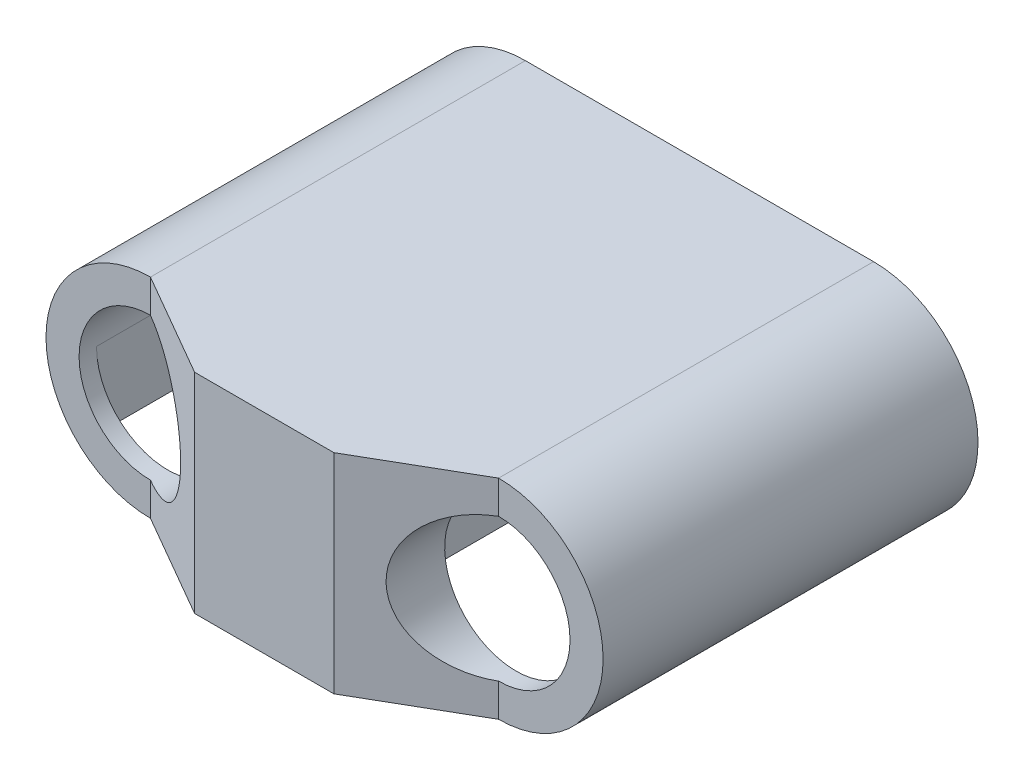
ISO-10303-21;
HEADER;
FILE_DESCRIPTION(('STEP AP214'),'2;1');
FILE_NAME('part.step','',(''),(''),'','','');
FILE_SCHEMA(('AUTOMOTIVE_DESIGN { 1 0 10303 214 1 1 1 1 }'));
ENDSEC;
DATA;
#1=APPLICATION_CONTEXT('core data for automotive mechanical design processes');
#2=APPLICATION_PROTOCOL_DEFINITION('international standard','automotive_design',2000,#1);
#3=PRODUCT_CONTEXT('',#1,'mechanical');
#4=PRODUCT('Part','Part','',(#3));
#5=PRODUCT_RELATED_PRODUCT_CATEGORY('part','',(#4));
#6=PRODUCT_DEFINITION_FORMATION('','',#4);
#7=PRODUCT_DEFINITION_CONTEXT('part definition',#1,'design');
#8=PRODUCT_DEFINITION('design','',#6,#7);
#9=PRODUCT_DEFINITION_SHAPE('','',#8);
#10=(LENGTH_UNIT() NAMED_UNIT(*) SI_UNIT(.MILLI.,.METRE.));
#11=(NAMED_UNIT(*) PLANE_ANGLE_UNIT() SI_UNIT($,.RADIAN.));
#12=(NAMED_UNIT(*) SI_UNIT($,.STERADIAN.) SOLID_ANGLE_UNIT());
#13=UNCERTAINTY_MEASURE_WITH_UNIT(LENGTH_MEASURE(1.E-05),#10,'distance_accuracy_value','');
#14=(GEOMETRIC_REPRESENTATION_CONTEXT(3) GLOBAL_UNCERTAINTY_ASSIGNED_CONTEXT((#13)) GLOBAL_UNIT_ASSIGNED_CONTEXT((#10,
#11,#12)) REPRESENTATION_CONTEXT('',''));
#15=CARTESIAN_POINT('',(0.,0.,0.));
#16=DIRECTION('',(0.,0.,1.));
#17=DIRECTION('',(1.,0.,0.));
#18=AXIS2_PLACEMENT_3D('',#15,#16,#17);
#19=CARTESIAN_POINT('',(-100.,0.,250.));
#20=DIRECTION('',(0.,0.,1.));
#21=DIRECTION('',(1.,0.,0.));
#22=AXIS2_PLACEMENT_3D('',#19,#20,#21);
#23=PLANE('',#22);
#24=DIRECTION('',(1.,0.,0.));
#25=VECTOR('',#24,1.);
#26=CARTESIAN_POINT('',(-100.,-60.,250.));
#27=LINE('',#26,#25);
#28=CARTESIAN_POINT('',(-40.,-60.,250.));
#29=VERTEX_POINT('',#28);
#30=CARTESIAN_POINT('',(40.,-60.,250.));
#31=VERTEX_POINT('',#30);
#32=EDGE_CURVE('E232',#29,#31,#27,.T.);
#33=ORIENTED_EDGE('',*,*,#32,.T.);
#34=DIRECTION('',(0.,1.,0.));
#35=VECTOR('',#34,1.);
#36=CARTESIAN_POINT('',(40.,-130.,250.));
#37=LINE('',#36,#35);
#38=CARTESIAN_POINT('',(40.,60.,250.));
#39=VERTEX_POINT('',#38);
#40=EDGE_CURVE('E334',#31,#39,#37,.T.);
#41=ORIENTED_EDGE('',*,*,#40,.T.);
#42=DIRECTION('',(-1.,0.,0.));
#43=VECTOR('',#42,1.);
#44=CARTESIAN_POINT('',(-100.,60.,250.));
#45=LINE('',#44,#43);
#46=CARTESIAN_POINT('',(-40.,60.,250.));
#47=VERTEX_POINT('',#46);
#48=EDGE_CURVE('E235',#39,#47,#45,.T.);
#49=ORIENTED_EDGE('',*,*,#48,.T.);
#50=DIRECTION('',(0.,1.,0.));
#51=VECTOR('',#50,1.);
#52=CARTESIAN_POINT('',(-40.,-130.,250.));
#53=LINE('',#52,#51);
#54=EDGE_CURVE('E342',#29,#47,#53,.T.);
#55=ORIENTED_EDGE('',*,*,#54,.F.);
#56=EDGE_LOOP('',(#33,#41,#49,#55));
#57=FACE_BOUND('',#56,.T.);
#58=ADVANCED_FACE('F48',(#57),#23,.T.);
#59=CARTESIAN_POINT('',(-100.,-60.,250.));
#60=DIRECTION('',(0.,1.,0.));
#61=DIRECTION('',(0.,0.,1.));
#62=AXIS2_PLACEMENT_3D('',#59,#60,#61);
#63=PLANE('',#62);
#64=DIRECTION('',(0.,0.,1.));
#65=VECTOR('',#64,1.);
#66=CARTESIAN_POINT('',(4.99999999999999,-60.,250.));
#67=LINE('',#66,#65);
#68=CARTESIAN_POINT('',(4.99999999999999,-60.,0.));
#69=VERTEX_POINT('',#68);
#70=CARTESIAN_POINT('',(4.99999999999999,-60.,200.358983848622));
#71=VERTEX_POINT('',#70);
#72=EDGE_CURVE('E319',#69,#71,#67,.T.);
#73=ORIENTED_EDGE('',*,*,#72,.T.);
#74=CARTESIAN_POINT('',(9.99999999999999,-60.,200.358983848622));
#75=DIRECTION('',(0.,1.,0.));
#76=DIRECTION('',(0.,0.,1.));
#77=AXIS2_PLACEMENT_3D('',#74,#75,#76);
#78=CIRCLE('',#77,5.);
#79=CARTESIAN_POINT('',(9.99999999999998,-60.,205.358983848622));
#80=VERTEX_POINT('',#79);
#81=EDGE_CURVE('E287',#71,#80,#78,.T.);
#82=ORIENTED_EDGE('',*,*,#81,.T.);
#83=DIRECTION('',(1.,0.,0.));
#84=VECTOR('',#83,1.);
#85=CARTESIAN_POINT('',(-100.,-60.,205.358983848622));
#86=LINE('',#85,#84);
#87=CARTESIAN_POINT('',(100.,-60.,205.358983848622));
#88=VERTEX_POINT('',#87);
#89=EDGE_CURVE('E332',#80,#88,#86,.T.);
#90=ORIENTED_EDGE('',*,*,#89,.T.);
#91=DIRECTION('',(0.,0.,-1.));
#92=VECTOR('',#91,1.);
#93=CARTESIAN_POINT('',(100.,-60.,250.));
#94=LINE('',#93,#92);
#95=CARTESIAN_POINT('',(100.,-60.,215.358983848622));
#96=VERTEX_POINT('',#95);
#97=EDGE_CURVE('E250',#96,#88,#94,.T.);
#98=ORIENTED_EDGE('',*,*,#97,.F.);
#99=DIRECTION('',(0.866025403784438,0.,-0.500000000000001));
#100=VECTOR('',#99,1.);
#101=CARTESIAN_POINT('',(-64.9999999999999,-60.,310.621778264911));
#102=LINE('',#101,#100);
#103=EDGE_CURVE('E228',#31,#96,#102,.T.);
#104=ORIENTED_EDGE('',*,*,#103,.F.);
#105=ORIENTED_EDGE('',*,*,#32,.F.);
#106=DIRECTION('',(-0.866025403784438,0.,-0.500000000000001));
#107=VECTOR('',#106,1.);
#108=CARTESIAN_POINT('',(-84.9999999999999,-60.,224.019237886467));
#109=LINE('',#108,#107);
#110=CARTESIAN_POINT('',(-100.,-60.,215.358983848622));
#111=VERTEX_POINT('',#110);
#112=EDGE_CURVE('E349',#29,#111,#109,.T.);
#113=ORIENTED_EDGE('',*,*,#112,.T.);
#114=DIRECTION('',(0.,0.,-1.));
#115=VECTOR('',#114,1.);
#116=CARTESIAN_POINT('',(-100.,-60.,250.));
#117=LINE('',#116,#115);
#118=CARTESIAN_POINT('',(-100.,-60.,205.358983848622));
#119=VERTEX_POINT('',#118);
#120=EDGE_CURVE('E253',#111,#119,#117,.T.);
#121=ORIENTED_EDGE('',*,*,#120,.T.);
#122=DIRECTION('',(1.,0.,0.));
#123=VECTOR('',#122,1.);
#124=CARTESIAN_POINT('',(-100.,-60.,205.358983848622));
#125=LINE('',#124,#123);
#126=CARTESIAN_POINT('',(-9.99999999999998,-60.,205.358983848622));
#127=VERTEX_POINT('',#126);
#128=EDGE_CURVE('E313',#119,#127,#125,.T.);
#129=ORIENTED_EDGE('',*,*,#128,.T.);
#130=CARTESIAN_POINT('',(-9.99999999999999,-60.,200.358983848622));
#131=DIRECTION('',(0.,1.,0.));
#132=DIRECTION('',(0.,0.,1.));
#133=AXIS2_PLACEMENT_3D('',#130,#131,#132);
#134=CIRCLE('',#133,5.);
#135=CARTESIAN_POINT('',(-4.99999999999999,-60.,200.358983848622));
#136=VERTEX_POINT('',#135);
#137=EDGE_CURVE('E13',#127,#136,#134,.T.);
#138=ORIENTED_EDGE('',*,*,#137,.T.);
#139=DIRECTION('',(0.,0.,-1.));
#140=VECTOR('',#139,1.);
#141=CARTESIAN_POINT('',(-4.99999999999999,-60.,250.));
#142=LINE('',#141,#140);
#143=CARTESIAN_POINT('',(-4.99999999999999,-60.,0.));
#144=VERTEX_POINT('',#143);
#145=EDGE_CURVE('E311',#136,#144,#142,.T.);
#146=ORIENTED_EDGE('',*,*,#145,.T.);
#147=DIRECTION('',(1.,0.,0.));
#148=VECTOR('',#147,1.);
#149=CARTESIAN_POINT('',(-100.,-60.,0.));
#150=LINE('',#149,#148);
#151=EDGE_CURVE('E225',#144,#69,#150,.T.);
#152=ORIENTED_EDGE('',*,*,#151,.T.);
#153=EDGE_LOOP('',(#73,#82,#90,#98,#104,#105,#113,#121,#129,#138,#146,#152));
#154=FACE_BOUND('',#153,.T.);
#155=ADVANCED_FACE('F310',(#154),#63,.F.);
#156=CARTESIAN_POINT('',(100.,0.,250.));
#157=DIRECTION('',(0.,0.,-1.));
#158=DIRECTION('',(-1.,0.,0.));
#159=AXIS2_PLACEMENT_3D('',#156,#157,#158);
#160=CYLINDRICAL_SURFACE('',#159,60.);
#161=ORIENTED_EDGE('',*,*,#97,.T.);
#162=CARTESIAN_POINT('',(100.,0.,205.358983848622));
#163=DIRECTION('',(0.,0.,1.));
#164=DIRECTION('',(1.,0.,0.));
#165=AXIS2_PLACEMENT_3D('',#162,#163,#164);
#166=CIRCLE('',#165,60.);
#167=CARTESIAN_POINT('',(141.,-43.806392227619,205.358983848622));
#168=VERTEX_POINT('',#167);
#169=EDGE_CURVE('E329',#88,#168,#166,.T.);
#170=ORIENTED_EDGE('',*,*,#169,.T.);
#171=DIRECTION('',(0.,0.,-1.));
#172=VECTOR('',#171,1.);
#173=CARTESIAN_POINT('',(141.,-43.806392227619,250.));
#174=LINE('',#173,#172);
#175=CARTESIAN_POINT('',(141.,-43.806392227619,0.));
#176=VERTEX_POINT('',#175);
#177=EDGE_CURVE('E321',#168,#176,#174,.T.);
#178=ORIENTED_EDGE('',*,*,#177,.T.);
#179=CARTESIAN_POINT('',(100.,0.,0.));
#180=DIRECTION('',(0.,0.,1.));
#181=DIRECTION('',(1.,0.,0.));
#182=AXIS2_PLACEMENT_3D('',#179,#180,#181);
#183=CIRCLE('',#182,60.);
#184=CARTESIAN_POINT('',(100.,60.,0.));
#185=VERTEX_POINT('',#184);
#186=EDGE_CURVE('E242',#176,#185,#183,.T.);
#187=ORIENTED_EDGE('',*,*,#186,.T.);
#188=DIRECTION('',(0.,0.,-1.));
#189=VECTOR('',#188,1.);
#190=CARTESIAN_POINT('',(100.,60.,250.));
#191=LINE('',#190,#189);
#192=CARTESIAN_POINT('',(100.,60.,215.358983848622));
#193=VERTEX_POINT('',#192);
#194=EDGE_CURVE('E247',#193,#185,#191,.T.);
#195=ORIENTED_EDGE('',*,*,#194,.F.);
#196=CARTESIAN_POINT('',(100.,0.,215.358983848622));
#197=DIRECTION('',(0.,0.,1.));
#198=DIRECTION('',(1.,0.,0.));
#199=AXIS2_PLACEMENT_3D('',#196,#197,#198);
#200=CIRCLE('',#199,60.);
#201=EDGE_CURVE('E354',#96,#193,#200,.T.);
#202=ORIENTED_EDGE('',*,*,#201,.F.);
#203=EDGE_LOOP('',(#161,#170,#178,#187,#195,#202));
#204=FACE_BOUND('',#203,.T.);
#205=ADVANCED_FACE('F373',(#204),#160,.T.);
#206=CARTESIAN_POINT('',(-100.,60.,250.));
#207=DIRECTION('',(0.,-1.,0.));
#208=DIRECTION('',(0.,0.,-1.));
#209=AXIS2_PLACEMENT_3D('',#206,#207,#208);
#210=PLANE('',#209);
#211=DIRECTION('',(-0.866025403784438,0.,0.500000000000001));
#212=VECTOR('',#211,1.);
#213=CARTESIAN_POINT('',(-64.9999999999999,60.,310.621778264911));
#214=LINE('',#213,#212);
#215=EDGE_CURVE('E357',#193,#39,#214,.T.);
#216=ORIENTED_EDGE('',*,*,#215,.F.);
#217=ORIENTED_EDGE('',*,*,#194,.T.);
#218=DIRECTION('',(-1.,0.,0.));
#219=VECTOR('',#218,1.);
#220=CARTESIAN_POINT('',(-100.,60.,0.));
#221=LINE('',#220,#219);
#222=CARTESIAN_POINT('',(-100.,60.,0.));
#223=VERTEX_POINT('',#222);
#224=EDGE_CURVE('E236',#185,#223,#221,.T.);
#225=ORIENTED_EDGE('',*,*,#224,.T.);
#226=DIRECTION('',(0.,0.,-1.));
#227=VECTOR('',#226,1.);
#228=CARTESIAN_POINT('',(-100.,60.,250.));
#229=LINE('',#228,#227);
#230=CARTESIAN_POINT('',(-100.,60.,215.358983848622));
#231=VERTEX_POINT('',#230);
#232=EDGE_CURVE('E238',#231,#223,#229,.T.);
#233=ORIENTED_EDGE('',*,*,#232,.F.);
#234=DIRECTION('',(0.866025403784438,0.,0.500000000000001));
#235=VECTOR('',#234,1.);
#236=CARTESIAN_POINT('',(-84.9999999999999,60.,224.019237886467));
#237=LINE('',#236,#235);
#238=EDGE_CURVE('E346',#231,#47,#237,.T.);
#239=ORIENTED_EDGE('',*,*,#238,.T.);
#240=ORIENTED_EDGE('',*,*,#48,.F.);
#241=EDGE_LOOP('',(#216,#217,#225,#233,#239,#240));
#242=FACE_BOUND('',#241,.T.);
#243=ADVANCED_FACE('F377',(#242),#210,.F.);
#244=CARTESIAN_POINT('',(100.,0.,250.));
#245=DIRECTION('',(0.,0.,-1.));
#246=DIRECTION('',(-1.,0.,0.));
#247=AXIS2_PLACEMENT_3D('',#244,#245,#246);
#248=CYLINDRICAL_SURFACE('',#247,41.);
#249=CARTESIAN_POINT('',(100.,0.,205.358983848622));
#250=DIRECTION('',(0.,0.,1.));
#251=DIRECTION('',(1.,0.,0.));
#252=AXIS2_PLACEMENT_3D('',#249,#250,#251);
#253=CIRCLE('',#252,41.);
#254=CARTESIAN_POINT('',(100.,41.,205.358983848622));
#255=VERTEX_POINT('',#254);
#256=CARTESIAN_POINT('',(141.,0.,205.358983848622));
#257=VERTEX_POINT('',#256);
#258=EDGE_CURVE('E214',#255,#257,#253,.T.);
#259=ORIENTED_EDGE('',*,*,#258,.F.);
#260=DIRECTION('',(0.,0.,-1.));
#261=VECTOR('',#260,1.);
#262=CARTESIAN_POINT('',(100.,41.,401.251313450852));
#263=LINE('',#262,#261);
#264=CARTESIAN_POINT('',(100.,41.,0.));
#265=VERTEX_POINT('',#264);
#266=EDGE_CURVE('E198',#255,#265,#263,.T.);
#267=ORIENTED_EDGE('',*,*,#266,.T.);
#268=CARTESIAN_POINT('',(100.,0.,0.));
#269=DIRECTION('',(0.,0.,1.));
#270=DIRECTION('',(1.,0.,0.));
#271=AXIS2_PLACEMENT_3D('',#268,#269,#270);
#272=CIRCLE('',#271,41.);
#273=CARTESIAN_POINT('',(141.,0.,0.));
#274=VERTEX_POINT('',#273);
#275=EDGE_CURVE('E213',#274,#265,#272,.T.);
#276=ORIENTED_EDGE('',*,*,#275,.F.);
#277=DIRECTION('',(0.,0.,-1.));
#278=VECTOR('',#277,1.);
#279=CARTESIAN_POINT('',(141.,0.,401.251313450852));
#280=LINE('',#279,#278);
#281=EDGE_CURVE('E215',#257,#274,#280,.T.);
#282=ORIENTED_EDGE('',*,*,#281,.F.);
#283=EDGE_LOOP('',(#259,#267,#276,#282));
#284=FACE_BOUND('',#283,.T.);
#285=CARTESIAN_POINT('',(100.,0.,215.358983848622));
#286=DIRECTION('',(0.,0.,1.));
#287=DIRECTION('',(1.,0.,0.));
#288=AXIS2_PLACEMENT_3D('',#285,#286,#287);
#289=CIRCLE('',#288,41.);
#290=CARTESIAN_POINT('',(100.,-41.,215.358983848622));
#291=VERTEX_POINT('',#290);
#292=CARTESIAN_POINT('',(100.,41.,215.358983848622));
#293=VERTEX_POINT('',#292);
#294=EDGE_CURVE('E261',#291,#293,#289,.T.);
#295=ORIENTED_EDGE('',*,*,#294,.T.);
#296=CARTESIAN_POINT('',(100.,0.,215.358983848622));
#297=DIRECTION('',(0.500000000000001,0.,0.866025403784438));
#298=DIRECTION('',(0.866025403784438,0.,-0.500000000000001));
#299=AXIS2_PLACEMENT_3D('',#296,#297,#298);
#300=ELLIPSE('',#299,47.3427220735493,41.);
#301=EDGE_CURVE('E264',#293,#291,#300,.T.);
#302=ORIENTED_EDGE('',*,*,#301,.T.);
#303=EDGE_LOOP('',(#295,#302));
#304=FACE_BOUND('',#303,.T.);
#305=ADVANCED_FACE('F210',(#284,#304),#248,.F.);
#306=CARTESIAN_POINT('',(-100.,0.,0.));
#307=DIRECTION('',(0.,0.,1.));
#308=DIRECTION('',(1.,0.,0.));
#309=AXIS2_PLACEMENT_3D('',#306,#307,#308);
#310=PLANE('',#309);
#311=ORIENTED_EDGE('',*,*,#186,.F.);
#312=DIRECTION('',(0.,-1.,0.));
#313=VECTOR('',#312,1.);
#314=CARTESIAN_POINT('',(141.,0.,0.));
#315=LINE('',#314,#313);
#316=EDGE_CURVE('E206',#274,#176,#315,.T.);
#317=ORIENTED_EDGE('',*,*,#316,.F.);
#318=ORIENTED_EDGE('',*,*,#275,.T.);
#319=DIRECTION('',(1.,0.,0.));
#320=VECTOR('',#319,1.);
#321=CARTESIAN_POINT('',(5.,41.,0.));
#322=LINE('',#321,#320);
#323=CARTESIAN_POINT('',(10.,41.,0.));
#324=VERTEX_POINT('',#323);
#325=EDGE_CURVE('E194',#324,#265,#322,.T.);
#326=ORIENTED_EDGE('',*,*,#325,.F.);
#327=CARTESIAN_POINT('',(10.,36.,0.));
#328=DIRECTION('',(0.,0.,1.));
#329=DIRECTION('',(1.,0.,0.));
#330=AXIS2_PLACEMENT_3D('',#327,#328,#329);
#331=CIRCLE('',#330,5.);
#332=CARTESIAN_POINT('',(5.00000000000001,36.,0.));
#333=VERTEX_POINT('',#332);
#334=EDGE_CURVE('E289',#324,#333,#331,.T.);
#335=ORIENTED_EDGE('',*,*,#334,.T.);
#336=DIRECTION('',(0.,-1.,0.));
#337=VECTOR('',#336,1.);
#338=CARTESIAN_POINT('',(5.,0.,0.));
#339=LINE('',#338,#337);
#340=EDGE_CURVE('E269',#333,#69,#339,.T.);
#341=ORIENTED_EDGE('',*,*,#340,.T.);
#342=ORIENTED_EDGE('',*,*,#151,.F.);
#343=DIRECTION('',(0.,-1.,0.));
#344=VECTOR('',#343,1.);
#345=CARTESIAN_POINT('',(-5.,41.,0.));
#346=LINE('',#345,#344);
#347=CARTESIAN_POINT('',(-5.,36.,0.));
#348=VERTEX_POINT('',#347);
#349=EDGE_CURVE('E317',#348,#144,#346,.T.);
#350=ORIENTED_EDGE('',*,*,#349,.F.);
#351=CARTESIAN_POINT('',(-10.,36.,0.));
#352=DIRECTION('',(0.,0.,1.));
#353=DIRECTION('',(1.,0.,0.));
#354=AXIS2_PLACEMENT_3D('',#351,#352,#353);
#355=CIRCLE('',#354,5.);
#356=CARTESIAN_POINT('',(-9.99999999999999,41.,0.));
#357=VERTEX_POINT('',#356);
#358=EDGE_CURVE('E57',#348,#357,#355,.T.);
#359=ORIENTED_EDGE('',*,*,#358,.T.);
#360=DIRECTION('',(1.,0.,0.));
#361=VECTOR('',#360,1.);
#362=CARTESIAN_POINT('',(-100.,41.,0.));
#363=LINE('',#362,#361);
#364=CARTESIAN_POINT('',(-100.,41.,0.));
#365=VERTEX_POINT('',#364);
#366=EDGE_CURVE('E400',#365,#357,#363,.T.);
#367=ORIENTED_EDGE('',*,*,#366,.F.);
#368=CARTESIAN_POINT('',(-100.,0.,0.));
#369=DIRECTION('',(0.,0.,1.));
#370=DIRECTION('',(-1.,0.,0.));
#371=AXIS2_PLACEMENT_3D('',#368,#369,#370);
#372=CIRCLE('',#371,41.);
#373=CARTESIAN_POINT('',(-141.,0.,0.));
#374=VERTEX_POINT('',#373);
#375=EDGE_CURVE('E222',#365,#374,#372,.T.);
#376=ORIENTED_EDGE('',*,*,#375,.T.);
#377=DIRECTION('',(0.,1.,0.));
#378=VECTOR('',#377,1.);
#379=CARTESIAN_POINT('',(-141.,0.,0.));
#380=LINE('',#379,#378);
#381=CARTESIAN_POINT('',(-141.,-43.806392227619,0.));
#382=VERTEX_POINT('',#381);
#383=EDGE_CURVE('E382',#382,#374,#380,.T.);
#384=ORIENTED_EDGE('',*,*,#383,.F.);
#385=CARTESIAN_POINT('',(-100.,0.,0.));
#386=DIRECTION('',(0.,0.,1.));
#387=DIRECTION('',(1.,0.,0.));
#388=AXIS2_PLACEMENT_3D('',#385,#386,#387);
#389=CIRCLE('',#388,60.);
#390=EDGE_CURVE('E221',#223,#382,#389,.T.);
#391=ORIENTED_EDGE('',*,*,#390,.F.);
#392=ORIENTED_EDGE('',*,*,#224,.F.);
#393=EDGE_LOOP('',(#311,#317,#318,#326,#335,#341,#342,#350,#359,#367,#376,#384,#391,#392));
#394=FACE_BOUND('',#393,.T.);
#395=ADVANCED_FACE('F220',(#394),#310,.F.);
#396=CARTESIAN_POINT('',(-100.,0.,250.));
#397=DIRECTION('',(0.,0.,-1.));
#398=DIRECTION('',(-1.,0.,0.));
#399=AXIS2_PLACEMENT_3D('',#396,#397,#398);
#400=CYLINDRICAL_SURFACE('',#399,60.);
#401=DIRECTION('',(0.,0.,-1.));
#402=VECTOR('',#401,1.);
#403=CARTESIAN_POINT('',(-141.,-43.806392227619,250.));
#404=LINE('',#403,#402);
#405=CARTESIAN_POINT('',(-141.,-43.806392227619,205.358983848622));
#406=VERTEX_POINT('',#405);
#407=EDGE_CURVE('E387',#382,#406,#404,.F.);
#408=ORIENTED_EDGE('',*,*,#407,.T.);
#409=CARTESIAN_POINT('',(-100.,0.,205.358983848622));
#410=DIRECTION('',(0.,0.,1.));
#411=DIRECTION('',(1.,0.,0.));
#412=AXIS2_PLACEMENT_3D('',#409,#410,#411);
#413=CIRCLE('',#412,60.);
#414=EDGE_CURVE('E323',#406,#119,#413,.T.);
#415=ORIENTED_EDGE('',*,*,#414,.T.);
#416=ORIENTED_EDGE('',*,*,#120,.F.);
#417=CARTESIAN_POINT('',(-100.,0.,215.358983848622));
#418=DIRECTION('',(0.,0.,-1.));
#419=DIRECTION('',(-1.,0.,0.));
#420=AXIS2_PLACEMENT_3D('',#417,#418,#419);
#421=CIRCLE('',#420,60.);
#422=EDGE_CURVE('E352',#111,#231,#421,.T.);
#423=ORIENTED_EDGE('',*,*,#422,.T.);
#424=ORIENTED_EDGE('',*,*,#232,.T.);
#425=ORIENTED_EDGE('',*,*,#390,.T.);
#426=EDGE_LOOP('',(#408,#415,#416,#423,#424,#425));
#427=FACE_BOUND('',#426,.T.);
#428=ADVANCED_FACE('F385',(#427),#400,.T.);
#429=CARTESIAN_POINT('',(-100.,0.,250.));
#430=DIRECTION('',(0.,0.,-1.));
#431=DIRECTION('',(-1.,0.,0.));
#432=AXIS2_PLACEMENT_3D('',#429,#430,#431);
#433=CYLINDRICAL_SURFACE('',#432,41.);
#434=CARTESIAN_POINT('',(-100.,0.,205.358983848622));
#435=DIRECTION('',(0.,0.,1.));
#436=DIRECTION('',(1.,0.,0.));
#437=AXIS2_PLACEMENT_3D('',#434,#435,#436);
#438=CIRCLE('',#437,41.);
#439=CARTESIAN_POINT('',(-141.,0.,205.358983848622));
#440=VERTEX_POINT('',#439);
#441=CARTESIAN_POINT('',(-100.,41.,205.358983848622));
#442=VERTEX_POINT('',#441);
#443=EDGE_CURVE('E267',#440,#442,#438,.T.);
#444=ORIENTED_EDGE('',*,*,#443,.F.);
#445=DIRECTION('',(0.,0.,-1.));
#446=VECTOR('',#445,1.);
#447=CARTESIAN_POINT('',(-141.,0.,401.251313450852));
#448=LINE('',#447,#446);
#449=EDGE_CURVE('E297',#440,#374,#448,.T.);
#450=ORIENTED_EDGE('',*,*,#449,.T.);
#451=ORIENTED_EDGE('',*,*,#375,.F.);
#452=DIRECTION('',(0.,0.,-1.));
#453=VECTOR('',#452,1.);
#454=CARTESIAN_POINT('',(-100.,41.,401.251313450852));
#455=LINE('',#454,#453);
#456=EDGE_CURVE('E292',#442,#365,#455,.T.);
#457=ORIENTED_EDGE('',*,*,#456,.F.);
#458=EDGE_LOOP('',(#444,#450,#451,#457));
#459=FACE_BOUND('',#458,.T.);
#460=CARTESIAN_POINT('',(-100.,0.,215.358983848622));
#461=DIRECTION('',(0.,0.,-1.));
#462=DIRECTION('',(-1.,0.,0.));
#463=AXIS2_PLACEMENT_3D('',#460,#461,#462);
#464=CIRCLE('',#463,41.);
#465=CARTESIAN_POINT('',(-100.,-41.,215.358983848622));
#466=VERTEX_POINT('',#465);
#467=CARTESIAN_POINT('',(-100.,40.9999999999999,215.358983848622));
#468=VERTEX_POINT('',#467);
#469=EDGE_CURVE('E258',#466,#468,#464,.T.);
#470=ORIENTED_EDGE('',*,*,#469,.F.);
#471=CARTESIAN_POINT('',(-100.,0.,215.358983848622));
#472=DIRECTION('',(0.500000000000001,0.,-0.866025403784438));
#473=DIRECTION('',(-0.866025403784438,0.,-0.500000000000001));
#474=AXIS2_PLACEMENT_3D('',#471,#472,#473);
#475=ELLIPSE('',#474,47.3427220735494,41.);
#476=EDGE_CURVE('E256',#468,#466,#475,.T.);
#477=ORIENTED_EDGE('',*,*,#476,.F.);
#478=EDGE_LOOP('',(#470,#477));
#479=FACE_BOUND('',#478,.T.);
#480=ADVANCED_FACE('F431',(#459,#479),#433,.F.);
#481=CARTESIAN_POINT('',(-118.253175473055,-130.,204.820508075689));
#482=DIRECTION('',(0.500000000000001,0.,-0.866025403784438));
#483=DIRECTION('',(-0.866025403784438,0.,-0.500000000000001));
#484=AXIS2_PLACEMENT_3D('',#481,#482,#483);
#485=PLANE('',#484);
#486=ORIENTED_EDGE('',*,*,#54,.T.);
#487=ORIENTED_EDGE('',*,*,#238,.F.);
#488=DIRECTION('',(0.,1.,0.));
#489=VECTOR('',#488,1.);
#490=CARTESIAN_POINT('',(-100.,-130.,215.358983848622));
#491=LINE('',#490,#489);
#492=EDGE_CURVE('E339',#468,#231,#491,.T.);
#493=ORIENTED_EDGE('',*,*,#492,.F.);
#494=ORIENTED_EDGE('',*,*,#476,.T.);
#495=EDGE_CURVE('E338',#111,#466,#491,.T.);
#496=ORIENTED_EDGE('',*,*,#495,.F.);
#497=ORIENTED_EDGE('',*,*,#112,.F.);
#498=EDGE_LOOP('',(#486,#487,#493,#494,#496,#497));
#499=FACE_BOUND('',#498,.T.);
#500=ADVANCED_FACE('F555',(#499),#485,.F.);
#501=CARTESIAN_POINT('',(0.,-130.,215.358983848622));
#502=DIRECTION('',(0.,0.,-1.));
#503=DIRECTION('',(-1.,0.,0.));
#504=AXIS2_PLACEMENT_3D('',#501,#502,#503);
#505=PLANE('',#504);
#506=ORIENTED_EDGE('',*,*,#422,.F.);
#507=ORIENTED_EDGE('',*,*,#495,.T.);
#508=ORIENTED_EDGE('',*,*,#469,.T.);
#509=ORIENTED_EDGE('',*,*,#492,.T.);
#510=EDGE_LOOP('',(#506,#507,#508,#509));
#511=FACE_BOUND('',#510,.T.);
#512=ADVANCED_FACE('F546',(#511),#505,.F.);
#513=CARTESIAN_POINT('',(118.253175473055,-130.,204.820508075689));
#514=DIRECTION('',(0.500000000000001,0.,0.866025403784438));
#515=DIRECTION('',(0.866025403784438,0.,-0.500000000000001));
#516=AXIS2_PLACEMENT_3D('',#513,#514,#515);
#517=PLANE('',#516);
#518=ORIENTED_EDGE('',*,*,#103,.T.);
#519=DIRECTION('',(0.,1.,0.));
#520=VECTOR('',#519,1.);
#521=CARTESIAN_POINT('',(100.,-130.,215.358983848622));
#522=LINE('',#521,#520);
#523=EDGE_CURVE('E337',#96,#291,#522,.T.);
#524=ORIENTED_EDGE('',*,*,#523,.T.);
#525=ORIENTED_EDGE('',*,*,#301,.F.);
#526=EDGE_CURVE('E335',#293,#193,#522,.T.);
#527=ORIENTED_EDGE('',*,*,#526,.T.);
#528=ORIENTED_EDGE('',*,*,#215,.T.);
#529=ORIENTED_EDGE('',*,*,#40,.F.);
#530=EDGE_LOOP('',(#518,#524,#525,#527,#528,#529));
#531=FACE_BOUND('',#530,.T.);
#532=ADVANCED_FACE('F363',(#531),#517,.T.);
#533=CARTESIAN_POINT('',(0.,-130.,215.358983848622));
#534=DIRECTION('',(0.,0.,1.));
#535=DIRECTION('',(1.,0.,0.));
#536=AXIS2_PLACEMENT_3D('',#533,#534,#535);
#537=PLANE('',#536);
#538=ORIENTED_EDGE('',*,*,#201,.T.);
#539=ORIENTED_EDGE('',*,*,#526,.F.);
#540=ORIENTED_EDGE('',*,*,#294,.F.);
#541=ORIENTED_EDGE('',*,*,#523,.F.);
#542=EDGE_LOOP('',(#538,#539,#540,#541));
#543=FACE_BOUND('',#542,.T.);
#544=ADVANCED_FACE('F368',(#543),#537,.T.);
#545=CARTESIAN_POINT('',(-5.,41.,401.251313450852));
#546=DIRECTION('',(1.,0.,0.));
#547=DIRECTION('',(0.,1.,0.));
#548=AXIS2_PLACEMENT_3D('',#545,#546,#547);
#549=PLANE('',#548);
#550=DIRECTION('',(0.,-1.,0.));
#551=VECTOR('',#550,1.);
#552=CARTESIAN_POINT('',(-5.,41.,200.358983848622));
#553=LINE('',#552,#551);
#554=CARTESIAN_POINT('',(-5.,36.,200.358983848622));
#555=VERTEX_POINT('',#554);
#556=EDGE_CURVE('E280',#136,#555,#553,.F.);
#557=ORIENTED_EDGE('',*,*,#556,.T.);
#558=DIRECTION('',(0.,0.,-1.));
#559=VECTOR('',#558,1.);
#560=CARTESIAN_POINT('',(-5.,36.,0.));
#561=LINE('',#560,#559);
#562=EDGE_CURVE('E282',#555,#348,#561,.T.);
#563=ORIENTED_EDGE('',*,*,#562,.T.);
#564=ORIENTED_EDGE('',*,*,#349,.T.);
#565=ORIENTED_EDGE('',*,*,#145,.F.);
#566=EDGE_LOOP('',(#557,#563,#564,#565));
#567=FACE_BOUND('',#566,.T.);
#568=ADVANCED_FACE('F315',(#567),#549,.F.);
#569=CARTESIAN_POINT('',(0.,-130.,205.358983848622));
#570=DIRECTION('',(0.,0.,1.));
#571=DIRECTION('',(1.,0.,0.));
#572=AXIS2_PLACEMENT_3D('',#569,#570,#571);
#573=PLANE('',#572);
#574=DIRECTION('',(1.,0.,0.));
#575=VECTOR('',#574,1.);
#576=CARTESIAN_POINT('',(-100.,41.,205.358983848622));
#577=LINE('',#576,#575);
#578=CARTESIAN_POINT('',(-9.99999999999999,41.,205.358983848622));
#579=VERTEX_POINT('',#578);
#580=EDGE_CURVE('E398',#442,#579,#577,.T.);
#581=ORIENTED_EDGE('',*,*,#580,.T.);
#582=DIRECTION('',(0.,-1.,0.));
#583=VECTOR('',#582,1.);
#584=CARTESIAN_POINT('',(-9.99999999999999,-60.,205.358983848622));
#585=LINE('',#584,#583);
#586=EDGE_CURVE('E65',#579,#127,#585,.T.);
#587=ORIENTED_EDGE('',*,*,#586,.T.);
#588=ORIENTED_EDGE('',*,*,#128,.F.);
#589=ORIENTED_EDGE('',*,*,#414,.F.);
#590=DIRECTION('',(0.,1.,0.));
#591=VECTOR('',#590,1.);
#592=CARTESIAN_POINT('',(-141.,0.,205.358983848622));
#593=LINE('',#592,#591);
#594=EDGE_CURVE('E403',#406,#440,#593,.T.);
#595=ORIENTED_EDGE('',*,*,#594,.T.);
#596=ORIENTED_EDGE('',*,*,#443,.T.);
#597=EDGE_LOOP('',(#581,#587,#588,#589,#595,#596));
#598=FACE_BOUND('',#597,.T.);
#599=ADVANCED_FACE('F436',(#598),#573,.F.);
#600=CARTESIAN_POINT('',(-141.,0.,401.251313450852));
#601=DIRECTION('',(-1.,0.,0.));
#602=DIRECTION('',(0.,0.,1.));
#603=AXIS2_PLACEMENT_3D('',#600,#601,#602);
#604=PLANE('',#603);
#605=ORIENTED_EDGE('',*,*,#383,.T.);
#606=ORIENTED_EDGE('',*,*,#449,.F.);
#607=ORIENTED_EDGE('',*,*,#594,.F.);
#608=ORIENTED_EDGE('',*,*,#407,.F.);
#609=EDGE_LOOP('',(#605,#606,#607,#608));
#610=FACE_BOUND('',#609,.T.);
#611=ADVANCED_FACE('F435',(#610),#604,.F.);
#612=CARTESIAN_POINT('',(-100.,41.,401.251313450852));
#613=DIRECTION('',(0.,1.,0.));
#614=DIRECTION('',(-1.,0.,0.));
#615=AXIS2_PLACEMENT_3D('',#612,#613,#614);
#616=PLANE('',#615);
#617=ORIENTED_EDGE('',*,*,#366,.T.);
#618=DIRECTION('',(0.,0.,-1.));
#619=VECTOR('',#618,1.);
#620=CARTESIAN_POINT('',(-10.,41.,205.358983848622));
#621=LINE('',#620,#619);
#622=EDGE_CURVE('E73',#357,#579,#621,.F.);
#623=ORIENTED_EDGE('',*,*,#622,.T.);
#624=ORIENTED_EDGE('',*,*,#580,.F.);
#625=ORIENTED_EDGE('',*,*,#456,.T.);
#626=EDGE_LOOP('',(#617,#623,#624,#625));
#627=FACE_BOUND('',#626,.T.);
#628=ADVANCED_FACE('F427',(#627),#616,.F.);
#629=CARTESIAN_POINT('',(0.,-130.,205.358983848622));
#630=DIRECTION('',(0.,0.,1.));
#631=DIRECTION('',(1.,0.,0.));
#632=AXIS2_PLACEMENT_3D('',#629,#630,#631);
#633=PLANE('',#632);
#634=ORIENTED_EDGE('',*,*,#89,.F.);
#635=DIRECTION('',(0.,1.,0.));
#636=VECTOR('',#635,1.);
#637=CARTESIAN_POINT('',(10.,41.,205.358983848622));
#638=LINE('',#637,#636);
#639=CARTESIAN_POINT('',(10.,41.,205.358983848622));
#640=VERTEX_POINT('',#639);
#641=EDGE_CURVE('E272',#80,#640,#638,.T.);
#642=ORIENTED_EDGE('',*,*,#641,.T.);
#643=DIRECTION('',(1.,0.,0.));
#644=VECTOR('',#643,1.);
#645=CARTESIAN_POINT('',(5.,41.,205.358983848622));
#646=LINE('',#645,#644);
#647=EDGE_CURVE('E216',#640,#255,#646,.T.);
#648=ORIENTED_EDGE('',*,*,#647,.T.);
#649=ORIENTED_EDGE('',*,*,#258,.T.);
#650=DIRECTION('',(0.,-1.,0.));
#651=VECTOR('',#650,1.);
#652=CARTESIAN_POINT('',(141.,0.,205.358983848622));
#653=LINE('',#652,#651);
#654=EDGE_CURVE('E205',#257,#168,#653,.T.);
#655=ORIENTED_EDGE('',*,*,#654,.T.);
#656=ORIENTED_EDGE('',*,*,#169,.F.);
#657=EDGE_LOOP('',(#634,#642,#648,#649,#655,#656));
#658=FACE_BOUND('',#657,.T.);
#659=ADVANCED_FACE('F415',(#658),#633,.F.);
#660=CARTESIAN_POINT('',(141.,0.,401.251313450852));
#661=DIRECTION('',(1.,0.,0.));
#662=DIRECTION('',(0.,0.,-1.));
#663=AXIS2_PLACEMENT_3D('',#660,#661,#662);
#664=PLANE('',#663);
#665=ORIENTED_EDGE('',*,*,#654,.F.);
#666=ORIENTED_EDGE('',*,*,#281,.T.);
#667=ORIENTED_EDGE('',*,*,#316,.T.);
#668=ORIENTED_EDGE('',*,*,#177,.F.);
#669=EDGE_LOOP('',(#665,#666,#667,#668));
#670=FACE_BOUND('',#669,.T.);
#671=ADVANCED_FACE('F413',(#670),#664,.F.);
#672=CARTESIAN_POINT('',(5.,41.,401.251313450852));
#673=DIRECTION('',(-1.,0.,0.));
#674=DIRECTION('',(0.,-1.,0.));
#675=AXIS2_PLACEMENT_3D('',#672,#673,#674);
#676=PLANE('',#675);
#677=DIRECTION('',(0.,0.,-1.));
#678=VECTOR('',#677,1.);
#679=CARTESIAN_POINT('',(5.,36.,205.358983848622));
#680=LINE('',#679,#678);
#681=CARTESIAN_POINT('',(5.,36.,200.358983848622));
#682=VERTEX_POINT('',#681);
#683=EDGE_CURVE('E275',#333,#682,#680,.F.);
#684=ORIENTED_EDGE('',*,*,#683,.T.);
#685=DIRECTION('',(0.,1.,0.));
#686=VECTOR('',#685,1.);
#687=CARTESIAN_POINT('',(4.99999999999999,-60.,200.358983848622));
#688=LINE('',#687,#686);
#689=EDGE_CURVE('E277',#682,#71,#688,.F.);
#690=ORIENTED_EDGE('',*,*,#689,.T.);
#691=ORIENTED_EDGE('',*,*,#72,.F.);
#692=ORIENTED_EDGE('',*,*,#340,.F.);
#693=EDGE_LOOP('',(#684,#690,#691,#692));
#694=FACE_BOUND('',#693,.T.);
#695=ADVANCED_FACE('F421',(#694),#676,.F.);
#696=CARTESIAN_POINT('',(5.,41.,401.251313450852));
#697=DIRECTION('',(0.,1.,0.));
#698=DIRECTION('',(-1.,0.,0.));
#699=AXIS2_PLACEMENT_3D('',#696,#697,#698);
#700=PLANE('',#699);
#701=ORIENTED_EDGE('',*,*,#647,.F.);
#702=DIRECTION('',(0.,0.,-1.));
#703=VECTOR('',#702,1.);
#704=CARTESIAN_POINT('',(10.,41.,0.));
#705=LINE('',#704,#703);
#706=EDGE_CURVE('E201',#640,#324,#705,.T.);
#707=ORIENTED_EDGE('',*,*,#706,.T.);
#708=ORIENTED_EDGE('',*,*,#325,.T.);
#709=ORIENTED_EDGE('',*,*,#266,.F.);
#710=EDGE_LOOP('',(#701,#707,#708,#709));
#711=FACE_BOUND('',#710,.T.);
#712=ADVANCED_FACE('F197',(#711),#700,.F.);
#713=CARTESIAN_POINT('',(10.,36.,401.251313450852));
#714=DIRECTION('',(0.,0.,1.));
#715=DIRECTION('',(1.,0.,0.));
#716=AXIS2_PLACEMENT_3D('',#713,#714,#715);
#717=CYLINDRICAL_SURFACE('',#716,5.);
#718=ORIENTED_EDGE('',*,*,#334,.F.);
#719=ORIENTED_EDGE('',*,*,#706,.F.);
#720=CARTESIAN_POINT('',(10.,36.,200.358983848622));
#721=DIRECTION('',(0.,-0.707106781186547,0.707106781186547));
#722=DIRECTION('',(0.,-0.707106781186547,-0.707106781186547));
#723=AXIS2_PLACEMENT_3D('',#720,#721,#722);
#724=ELLIPSE('',#723,7.07106781186547,5.);
#725=EDGE_CURVE('E291',#682,#640,#724,.F.);
#726=ORIENTED_EDGE('',*,*,#725,.F.);
#727=ORIENTED_EDGE('',*,*,#683,.F.);
#728=EDGE_LOOP('',(#718,#719,#726,#727));
#729=FACE_BOUND('',#728,.T.);
#730=ADVANCED_FACE('F424',(#729),#717,.F.);
#731=CARTESIAN_POINT('',(9.99999999999998,-130.,200.358983848622));
#732=DIRECTION('',(0.,-1.,0.));
#733=DIRECTION('',(1.,0.,0.));
#734=AXIS2_PLACEMENT_3D('',#731,#732,#733);
#735=CYLINDRICAL_SURFACE('',#734,5.);
#736=ORIENTED_EDGE('',*,*,#81,.F.);
#737=ORIENTED_EDGE('',*,*,#689,.F.);
#738=ORIENTED_EDGE('',*,*,#725,.T.);
#739=ORIENTED_EDGE('',*,*,#641,.F.);
#740=EDGE_LOOP('',(#736,#737,#738,#739));
#741=FACE_BOUND('',#740,.T.);
#742=ADVANCED_FACE('F417',(#741),#735,.F.);
#743=CARTESIAN_POINT('',(-9.99999999999998,-130.,200.358983848622));
#744=DIRECTION('',(0.,1.,0.));
#745=DIRECTION('',(-1.,0.,0.));
#746=AXIS2_PLACEMENT_3D('',#743,#744,#745);
#747=CYLINDRICAL_SURFACE('',#746,5.);
#748=ORIENTED_EDGE('',*,*,#137,.F.);
#749=ORIENTED_EDGE('',*,*,#586,.F.);
#750=CARTESIAN_POINT('',(-10.,36.,200.358983848622));
#751=DIRECTION('',(0.,-0.707106781186547,0.707106781186547));
#752=DIRECTION('',(0.,0.707106781186547,0.707106781186547));
#753=AXIS2_PLACEMENT_3D('',#750,#751,#752);
#754=ELLIPSE('',#753,7.07106781186547,5.);
#755=EDGE_CURVE('E52',#555,#579,#754,.T.);
#756=ORIENTED_EDGE('',*,*,#755,.F.);
#757=ORIENTED_EDGE('',*,*,#556,.F.);
#758=EDGE_LOOP('',(#748,#749,#756,#757));
#759=FACE_BOUND('',#758,.T.);
#760=ADVANCED_FACE('F50',(#759),#747,.F.);
#761=CARTESIAN_POINT('',(-10.,36.,401.251313450852));
#762=DIRECTION('',(0.,0.,1.));
#763=DIRECTION('',(1.,0.,0.));
#764=AXIS2_PLACEMENT_3D('',#761,#762,#763);
#765=CYLINDRICAL_SURFACE('',#764,5.);
#766=ORIENTED_EDGE('',*,*,#755,.T.);
#767=ORIENTED_EDGE('',*,*,#622,.F.);
#768=ORIENTED_EDGE('',*,*,#358,.F.);
#769=ORIENTED_EDGE('',*,*,#562,.F.);
#770=EDGE_LOOP('',(#766,#767,#768,#769));
#771=FACE_BOUND('',#770,.T.);
#772=ADVANCED_FACE('F303',(#771),#765,.F.);
#773=CLOSED_SHELL('',(#58,#155,#205,#243,#305,#395,#428,#480,#500,#512,#532,#544,#568,#599,#611,
#628,#659,#671,#695,#712,#730,#742,#760,#772));
#774=MANIFOLD_SOLID_BREP('B2',#773);
#775=ADVANCED_BREP_SHAPE_REPRESENTATION('',(#18,#774),#14);
#776=SHAPE_DEFINITION_REPRESENTATION(#9,#775);
ENDSEC;
END-ISO-10303-21;
